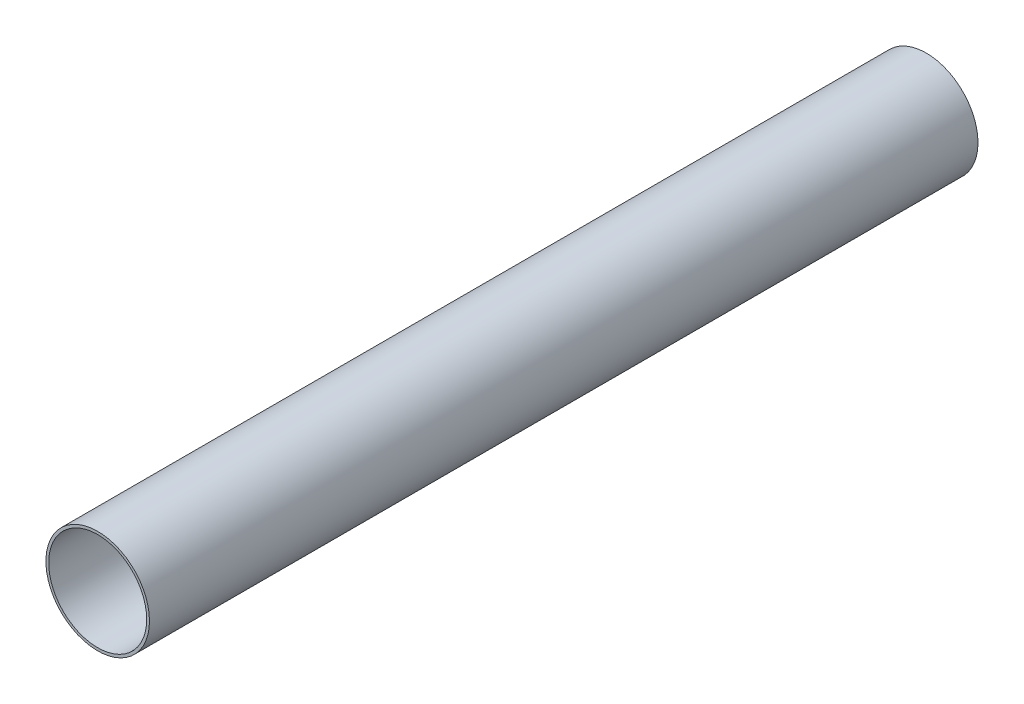
ISO-10303-21;
HEADER;
FILE_DESCRIPTION(('STEP AP214'),'2;1');
FILE_NAME('part.step','',(''),(''),'','','');
FILE_SCHEMA(('AUTOMOTIVE_DESIGN { 1 0 10303 214 1 1 1 1 }'));
ENDSEC;
DATA;
#1=APPLICATION_CONTEXT('core data for automotive mechanical design processes');
#2=APPLICATION_PROTOCOL_DEFINITION('international standard','automotive_design',2000,#1);
#3=PRODUCT_CONTEXT('',#1,'mechanical');
#4=PRODUCT('Part','Part','',(#3));
#5=PRODUCT_RELATED_PRODUCT_CATEGORY('part','',(#4));
#6=PRODUCT_DEFINITION_FORMATION('','',#4);
#7=PRODUCT_DEFINITION_CONTEXT('part definition',#1,'design');
#8=PRODUCT_DEFINITION('design','',#6,#7);
#9=PRODUCT_DEFINITION_SHAPE('','',#8);
#10=(LENGTH_UNIT() NAMED_UNIT(*) SI_UNIT(.MILLI.,.METRE.));
#11=(NAMED_UNIT(*) PLANE_ANGLE_UNIT() SI_UNIT($,.RADIAN.));
#12=(NAMED_UNIT(*) SI_UNIT($,.STERADIAN.) SOLID_ANGLE_UNIT());
#13=UNCERTAINTY_MEASURE_WITH_UNIT(LENGTH_MEASURE(1.E-05),#10,'distance_accuracy_value','');
#14=(GEOMETRIC_REPRESENTATION_CONTEXT(3) GLOBAL_UNCERTAINTY_ASSIGNED_CONTEXT((#13)) GLOBAL_UNIT_ASSIGNED_CONTEXT((#10,
#11,#12)) REPRESENTATION_CONTEXT('',''));
#15=CARTESIAN_POINT('',(0.,0.,0.));
#16=DIRECTION('',(0.,0.,1.));
#17=DIRECTION('',(1.,0.,0.));
#18=AXIS2_PLACEMENT_3D('',#15,#16,#17);
#19=CARTESIAN_POINT('',(0.,0.,600.));
#20=DIRECTION('',(0.,0.,1.));
#21=DIRECTION('',(1.,0.,0.));
#22=AXIS2_PLACEMENT_3D('',#19,#20,#21);
#23=PLANE('',#22);
#24=CARTESIAN_POINT('',(0.,0.,600.));
#25=DIRECTION('',(0.,0.,1.));
#26=DIRECTION('',(1.,0.,0.));
#27=AXIS2_PLACEMENT_3D('',#24,#25,#26);
#28=CIRCLE('',#27,37.5);
#29=CARTESIAN_POINT('',(37.5,0.,600.));
#30=VERTEX_POINT('',#29);
#31=EDGE_CURVE('E10',#30,#30,#28,.T.);
#32=ORIENTED_EDGE('',*,*,#31,.T.);
#33=EDGE_LOOP('',(#32));
#34=FACE_BOUND('',#33,.T.);
#35=CARTESIAN_POINT('',(0.,0.,600.));
#36=DIRECTION('',(0.,0.,1.));
#37=DIRECTION('',(1.,0.,0.));
#38=AXIS2_PLACEMENT_3D('',#35,#36,#37);
#39=CIRCLE('',#38,35.5);
#40=CARTESIAN_POINT('',(35.5,0.,600.));
#41=VERTEX_POINT('',#40);
#42=EDGE_CURVE('E56',#41,#41,#39,.T.);
#43=ORIENTED_EDGE('',*,*,#42,.F.);
#44=EDGE_LOOP('',(#43));
#45=FACE_BOUND('',#44,.T.);
#46=ADVANCED_FACE('F43',(#34,#45),#23,.T.);
#47=CARTESIAN_POINT('',(0.,0.,0.));
#48=DIRECTION('',(0.,0.,1.));
#49=DIRECTION('',(1.,0.,0.));
#50=AXIS2_PLACEMENT_3D('',#47,#48,#49);
#51=PLANE('',#50);
#52=CARTESIAN_POINT('',(0.,0.,0.));
#53=DIRECTION('',(0.,0.,1.));
#54=DIRECTION('',(1.,0.,0.));
#55=AXIS2_PLACEMENT_3D('',#52,#53,#54);
#56=CIRCLE('',#55,37.5);
#57=CARTESIAN_POINT('',(37.5,0.,0.));
#58=VERTEX_POINT('',#57);
#59=EDGE_CURVE('E47',#58,#58,#56,.T.);
#60=ORIENTED_EDGE('',*,*,#59,.F.);
#61=EDGE_LOOP('',(#60));
#62=FACE_BOUND('',#61,.T.);
#63=CARTESIAN_POINT('',(0.,0.,0.));
#64=DIRECTION('',(0.,0.,1.));
#65=DIRECTION('',(1.,0.,0.));
#66=AXIS2_PLACEMENT_3D('',#63,#64,#65);
#67=CIRCLE('',#66,35.5);
#68=CARTESIAN_POINT('',(35.5,0.,0.));
#69=VERTEX_POINT('',#68);
#70=EDGE_CURVE('E58',#69,#69,#67,.T.);
#71=ORIENTED_EDGE('',*,*,#70,.T.);
#72=EDGE_LOOP('',(#71));
#73=FACE_BOUND('',#72,.T.);
#74=ADVANCED_FACE('F70',(#62,#73),#51,.F.);
#75=CARTESIAN_POINT('',(0.,0.,600.));
#76=DIRECTION('',(0.,0.,-1.));
#77=DIRECTION('',(-1.,0.,0.));
#78=AXIS2_PLACEMENT_3D('',#75,#76,#77);
#79=CYLINDRICAL_SURFACE('',#78,37.5);
#80=ORIENTED_EDGE('',*,*,#31,.F.);
#81=EDGE_LOOP('',(#80));
#82=FACE_BOUND('',#81,.T.);
#83=ORIENTED_EDGE('',*,*,#59,.T.);
#84=EDGE_LOOP('',(#83));
#85=FACE_BOUND('',#84,.T.);
#86=ADVANCED_FACE('F45',(#82,#85),#79,.T.);
#87=CARTESIAN_POINT('',(0.,0.,600.));
#88=DIRECTION('',(0.,0.,-1.));
#89=DIRECTION('',(-1.,0.,0.));
#90=AXIS2_PLACEMENT_3D('',#87,#88,#89);
#91=CYLINDRICAL_SURFACE('',#90,35.5);
#92=ORIENTED_EDGE('',*,*,#42,.T.);
#93=EDGE_LOOP('',(#92));
#94=FACE_BOUND('',#93,.T.);
#95=ORIENTED_EDGE('',*,*,#70,.F.);
#96=EDGE_LOOP('',(#95));
#97=FACE_BOUND('',#96,.T.);
#98=ADVANCED_FACE('F66',(#94,#97),#91,.F.);
#99=CLOSED_SHELL('',(#46,#74,#86,#98));
#100=MANIFOLD_SOLID_BREP('B2',#99);
#101=ADVANCED_BREP_SHAPE_REPRESENTATION('',(#18,#100),#14);
#102=SHAPE_DEFINITION_REPRESENTATION(#9,#101);
ENDSEC;
END-ISO-10303-21;
